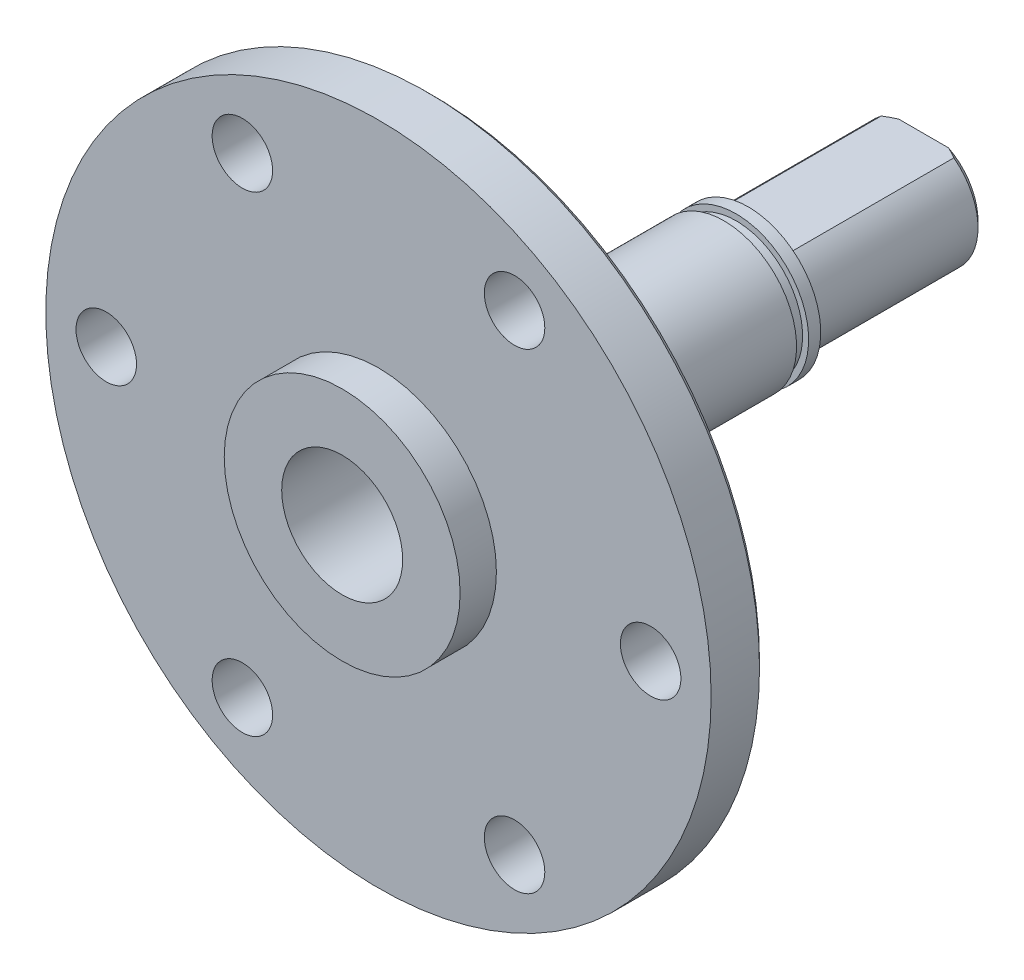
ISO-10303-21;
HEADER;
FILE_DESCRIPTION(('STEP AP214'),'2;1');
FILE_NAME('part.step','',(''),(''),'','','');
FILE_SCHEMA(('AUTOMOTIVE_DESIGN { 1 0 10303 214 1 1 1 1 }'));
ENDSEC;
DATA;
#1=APPLICATION_CONTEXT('core data for automotive mechanical design processes');
#2=APPLICATION_PROTOCOL_DEFINITION('international standard','automotive_design',2000,#1);
#3=PRODUCT_CONTEXT('',#1,'mechanical');
#4=PRODUCT('Part','Part','',(#3));
#5=PRODUCT_RELATED_PRODUCT_CATEGORY('part','',(#4));
#6=PRODUCT_DEFINITION_FORMATION('','',#4);
#7=PRODUCT_DEFINITION_CONTEXT('part definition',#1,'design');
#8=PRODUCT_DEFINITION('design','',#6,#7);
#9=PRODUCT_DEFINITION_SHAPE('','',#8);
#10=(LENGTH_UNIT() NAMED_UNIT(*) SI_UNIT(.MILLI.,.METRE.));
#11=(NAMED_UNIT(*) PLANE_ANGLE_UNIT() SI_UNIT($,.RADIAN.));
#12=(NAMED_UNIT(*) SI_UNIT($,.STERADIAN.) SOLID_ANGLE_UNIT());
#13=UNCERTAINTY_MEASURE_WITH_UNIT(LENGTH_MEASURE(1.E-05),#10,'distance_accuracy_value','');
#14=(GEOMETRIC_REPRESENTATION_CONTEXT(3) GLOBAL_UNCERTAINTY_ASSIGNED_CONTEXT((#13)) GLOBAL_UNIT_ASSIGNED_CONTEXT((#10,
#11,#12)) REPRESENTATION_CONTEXT('',''));
#15=CARTESIAN_POINT('',(0.,0.,0.));
#16=DIRECTION('',(0.,0.,1.));
#17=DIRECTION('',(1.,0.,0.));
#18=AXIS2_PLACEMENT_3D('',#15,#16,#17);
#19=CARTESIAN_POINT('',(0.,0.,3.));
#20=DIRECTION('',(0.,0.,1.));
#21=DIRECTION('',(1.,0.,0.));
#22=AXIS2_PLACEMENT_3D('',#19,#20,#21);
#23=PLANE('',#22);
#24=CARTESIAN_POINT('',(-22.5,0.,3.));
#25=DIRECTION('',(0.,0.,1.));
#26=DIRECTION('',(1.,0.,0.));
#27=AXIS2_PLACEMENT_3D('',#24,#25,#26);
#28=CIRCLE('',#27,2.49999999999998);
#29=CARTESIAN_POINT('',(-20.,0.,3.));
#30=VERTEX_POINT('',#29);
#31=EDGE_CURVE('E104',#30,#30,#28,.T.);
#32=ORIENTED_EDGE('',*,*,#31,.F.);
#33=EDGE_LOOP('',(#32));
#34=FACE_BOUND('',#33,.T.);
#35=CARTESIAN_POINT('',(-11.25,19.48557158515,3.));
#36=DIRECTION('',(0.,0.,1.));
#37=DIRECTION('',(1.,0.,0.));
#38=AXIS2_PLACEMENT_3D('',#35,#36,#37);
#39=CIRCLE('',#38,2.49999999999998);
#40=CARTESIAN_POINT('',(-8.75000000000001,19.48557158515,3.));
#41=VERTEX_POINT('',#40);
#42=EDGE_CURVE('E110',#41,#41,#39,.T.);
#43=ORIENTED_EDGE('',*,*,#42,.F.);
#44=EDGE_LOOP('',(#43));
#45=FACE_BOUND('',#44,.T.);
#46=CARTESIAN_POINT('',(11.25,19.48557158515,3.));
#47=DIRECTION('',(0.,0.,1.));
#48=DIRECTION('',(1.,0.,0.));
#49=AXIS2_PLACEMENT_3D('',#46,#47,#48);
#50=CIRCLE('',#49,2.49999999999998);
#51=CARTESIAN_POINT('',(13.75,19.48557158515,3.));
#52=VERTEX_POINT('',#51);
#53=EDGE_CURVE('E116',#52,#52,#50,.T.);
#54=ORIENTED_EDGE('',*,*,#53,.F.);
#55=EDGE_LOOP('',(#54));
#56=FACE_BOUND('',#55,.T.);
#57=CARTESIAN_POINT('',(22.5,0.,3.));
#58=DIRECTION('',(0.,0.,1.));
#59=DIRECTION('',(1.,0.,0.));
#60=AXIS2_PLACEMENT_3D('',#57,#58,#59);
#61=CIRCLE('',#60,2.49999999999998);
#62=CARTESIAN_POINT('',(25.,0.,3.));
#63=VERTEX_POINT('',#62);
#64=EDGE_CURVE('E122',#63,#63,#61,.T.);
#65=ORIENTED_EDGE('',*,*,#64,.F.);
#66=EDGE_LOOP('',(#65));
#67=FACE_BOUND('',#66,.T.);
#68=CARTESIAN_POINT('',(11.25,-19.48557158515,3.));
#69=DIRECTION('',(0.,0.,1.));
#70=DIRECTION('',(1.,0.,0.));
#71=AXIS2_PLACEMENT_3D('',#68,#69,#70);
#72=CIRCLE('',#71,2.49999999999998);
#73=CARTESIAN_POINT('',(13.75,-19.48557158515,3.));
#74=VERTEX_POINT('',#73);
#75=EDGE_CURVE('E128',#74,#74,#72,.T.);
#76=ORIENTED_EDGE('',*,*,#75,.F.);
#77=EDGE_LOOP('',(#76));
#78=FACE_BOUND('',#77,.T.);
#79=CARTESIAN_POINT('',(-11.25,-19.48557158515,3.));
#80=DIRECTION('',(0.,0.,1.));
#81=DIRECTION('',(1.,0.,0.));
#82=AXIS2_PLACEMENT_3D('',#79,#80,#81);
#83=CIRCLE('',#82,2.49999999999998);
#84=CARTESIAN_POINT('',(-8.75000000000001,-19.48557158515,3.));
#85=VERTEX_POINT('',#84);
#86=EDGE_CURVE('E134',#85,#85,#83,.T.);
#87=ORIENTED_EDGE('',*,*,#86,.F.);
#88=EDGE_LOOP('',(#87));
#89=FACE_BOUND('',#88,.T.);
#90=CARTESIAN_POINT('',(0.,0.,3.));
#91=DIRECTION('',(0.,0.,1.));
#92=DIRECTION('',(1.,0.,0.));
#93=AXIS2_PLACEMENT_3D('',#90,#91,#92);
#94=CIRCLE('',#93,27.5);
#95=CARTESIAN_POINT('',(27.5,0.,3.));
#96=VERTEX_POINT('',#95);
#97=EDGE_CURVE('E144',#96,#96,#94,.T.);
#98=ORIENTED_EDGE('',*,*,#97,.T.);
#99=EDGE_LOOP('',(#98));
#100=FACE_BOUND('',#99,.T.);
#101=CARTESIAN_POINT('',(0.,0.,3.));
#102=DIRECTION('',(0.,0.,1.));
#103=DIRECTION('',(1.,0.,0.));
#104=AXIS2_PLACEMENT_3D('',#101,#102,#103);
#105=CIRCLE('',#104,9.75);
#106=CARTESIAN_POINT('',(9.75,0.,3.));
#107=VERTEX_POINT('',#106);
#108=EDGE_CURVE('E137',#107,#107,#105,.T.);
#109=ORIENTED_EDGE('',*,*,#108,.F.);
#110=EDGE_LOOP('',(#109));
#111=FACE_BOUND('',#110,.T.);
#112=ADVANCED_FACE('F45',(#34,#45,#56,#67,#78,#89,#100,#111),#23,.T.);
#113=CARTESIAN_POINT('',(0.,0.,-27.56));
#114=DIRECTION('',(0.,0.,-1.));
#115=DIRECTION('',(-1.,0.,0.));
#116=AXIS2_PLACEMENT_3D('',#113,#114,#115);
#117=PLANE('',#116);
#118=CARTESIAN_POINT('',(0.,0.,-27.56));
#119=DIRECTION('',(0.,0.,-1.));
#120=DIRECTION('',(-1.,0.,0.));
#121=AXIS2_PLACEMENT_3D('',#118,#119,#120);
#122=CIRCLE('',#121,6.);
#123=CARTESIAN_POINT('',(-6.,0.,-27.56));
#124=VERTEX_POINT('',#123);
#125=EDGE_CURVE('E143',#124,#124,#122,.F.);
#126=ORIENTED_EDGE('',*,*,#125,.F.);
#127=EDGE_LOOP('',(#126));
#128=FACE_BOUND('',#127,.T.);
#129=CARTESIAN_POINT('',(0.,0.,-27.56));
#130=DIRECTION('',(0.,0.,-1.));
#131=DIRECTION('',(-1.,0.,0.));
#132=AXIS2_PLACEMENT_3D('',#129,#130,#131);
#133=CIRCLE('',#132,5.);
#134=CARTESIAN_POINT('',(-5.,0.,-27.56));
#135=VERTEX_POINT('',#134);
#136=EDGE_CURVE('E140',#135,#135,#133,.T.);
#137=ORIENTED_EDGE('',*,*,#136,.F.);
#138=EDGE_LOOP('',(#137));
#139=FACE_BOUND('',#138,.T.);
#140=ADVANCED_FACE('F317',(#128,#139),#117,.T.);
#141=CARTESIAN_POINT('',(0.,0.,-26.56));
#142=DIRECTION('',(0.,0.,-1.));
#143=DIRECTION('',(-1.,0.,0.));
#144=AXIS2_PLACEMENT_3D('',#141,#142,#143);
#145=CYLINDRICAL_SURFACE('',#144,6.);
#146=ORIENTED_EDGE('',*,*,#125,.T.);
#147=EDGE_LOOP('',(#146));
#148=FACE_BOUND('',#147,.T.);
#149=CARTESIAN_POINT('',(0.,0.,-26.56));
#150=DIRECTION('',(0.,0.,-1.));
#151=DIRECTION('',(-1.,0.,0.));
#152=AXIS2_PLACEMENT_3D('',#149,#150,#151);
#153=CIRCLE('',#152,6.);
#154=CARTESIAN_POINT('',(-6.,0.,-26.56));
#155=VERTEX_POINT('',#154);
#156=EDGE_CURVE('E170',#155,#155,#153,.T.);
#157=ORIENTED_EDGE('',*,*,#156,.T.);
#158=EDGE_LOOP('',(#157));
#159=FACE_BOUND('',#158,.T.);
#160=ADVANCED_FACE('F314',(#148,#159),#145,.T.);
#161=CARTESIAN_POINT('',(0.,0.,-26.56));
#162=DIRECTION('',(0.,0.,-1.));
#163=DIRECTION('',(-1.,0.,0.));
#164=AXIS2_PLACEMENT_3D('',#161,#162,#163);
#165=PLANE('',#164);
#166=CARTESIAN_POINT('',(0.,0.,-26.56));
#167=DIRECTION('',(0.,0.,-1.));
#168=DIRECTION('',(-1.,0.,0.));
#169=AXIS2_PLACEMENT_3D('',#166,#167,#168);
#170=CIRCLE('',#169,5.5);
#171=CARTESIAN_POINT('',(-5.5,0.,-26.56));
#172=VERTEX_POINT('',#171);
#173=EDGE_CURVE('E176',#172,#172,#170,.F.);
#174=ORIENTED_EDGE('',*,*,#173,.F.);
#175=EDGE_LOOP('',(#174));
#176=FACE_BOUND('',#175,.T.);
#177=ORIENTED_EDGE('',*,*,#156,.F.);
#178=EDGE_LOOP('',(#177));
#179=FACE_BOUND('',#178,.T.);
#180=ADVANCED_FACE('F345',(#176,#179),#165,.F.);
#181=CARTESIAN_POINT('',(0.,0.,-25.56));
#182=DIRECTION('',(0.,0.,-1.));
#183=DIRECTION('',(-1.,0.,0.));
#184=AXIS2_PLACEMENT_3D('',#181,#182,#183);
#185=CYLINDRICAL_SURFACE('',#184,5.5);
#186=CARTESIAN_POINT('',(0.,0.,-25.56));
#187=DIRECTION('',(0.,0.,-1.));
#188=DIRECTION('',(-1.,0.,0.));
#189=AXIS2_PLACEMENT_3D('',#186,#187,#188);
#190=CIRCLE('',#189,5.5);
#191=CARTESIAN_POINT('',(-5.5,0.,-25.56));
#192=VERTEX_POINT('',#191);
#193=EDGE_CURVE('E379',#192,#192,#190,.F.);
#194=ORIENTED_EDGE('',*,*,#193,.F.);
#195=EDGE_LOOP('',(#194));
#196=FACE_BOUND('',#195,.T.);
#197=ORIENTED_EDGE('',*,*,#173,.T.);
#198=EDGE_LOOP('',(#197));
#199=FACE_BOUND('',#198,.T.);
#200=ADVANCED_FACE('F341',(#196,#199),#185,.T.);
#201=CARTESIAN_POINT('',(0.,0.,-25.56));
#202=DIRECTION('',(0.,0.,-1.));
#203=DIRECTION('',(-1.,0.,0.));
#204=AXIS2_PLACEMENT_3D('',#201,#202,#203);
#205=PLANE('',#204);
#206=ORIENTED_EDGE('',*,*,#193,.T.);
#207=EDGE_LOOP('',(#206));
#208=FACE_BOUND('',#207,.T.);
#209=CARTESIAN_POINT('',(0.,0.,-25.56));
#210=DIRECTION('',(0.,0.,-1.));
#211=DIRECTION('',(-1.,0.,0.));
#212=AXIS2_PLACEMENT_3D('',#209,#210,#211);
#213=CIRCLE('',#212,6.);
#214=CARTESIAN_POINT('',(-6.,0.,-25.56));
#215=VERTEX_POINT('',#214);
#216=EDGE_CURVE('E373',#215,#215,#213,.F.);
#217=ORIENTED_EDGE('',*,*,#216,.F.);
#218=EDGE_LOOP('',(#217));
#219=FACE_BOUND('',#218,.T.);
#220=ADVANCED_FACE('F337',(#208,#219),#205,.T.);
#221=CARTESIAN_POINT('',(0.,0.,-14.56));
#222=DIRECTION('',(0.,0.,-1.));
#223=DIRECTION('',(-1.,0.,0.));
#224=AXIS2_PLACEMENT_3D('',#221,#222,#223);
#225=CYLINDRICAL_SURFACE('',#224,6.);
#226=ORIENTED_EDGE('',*,*,#216,.T.);
#227=EDGE_LOOP('',(#226));
#228=FACE_BOUND('',#227,.T.);
#229=CARTESIAN_POINT('',(0.,0.,-14.56));
#230=DIRECTION('',(0.,0.,-1.));
#231=DIRECTION('',(-1.,0.,0.));
#232=AXIS2_PLACEMENT_3D('',#229,#230,#231);
#233=CIRCLE('',#232,6.);
#234=CARTESIAN_POINT('',(-6.,0.,-14.56));
#235=VERTEX_POINT('',#234);
#236=EDGE_CURVE('E369',#235,#235,#233,.F.);
#237=ORIENTED_EDGE('',*,*,#236,.F.);
#238=EDGE_LOOP('',(#237));
#239=FACE_BOUND('',#238,.T.);
#240=ADVANCED_FACE('F333',(#228,#239),#225,.T.);
#241=CARTESIAN_POINT('',(0.,0.,-14.56));
#242=DIRECTION('',(0.,0.,-1.));
#243=DIRECTION('',(-1.,0.,0.));
#244=AXIS2_PLACEMENT_3D('',#241,#242,#243);
#245=PLANE('',#244);
#246=CARTESIAN_POINT('',(0.,0.,-14.56));
#247=DIRECTION('',(0.,0.,-1.));
#248=DIRECTION('',(-1.,0.,0.));
#249=AXIS2_PLACEMENT_3D('',#246,#247,#248);
#250=CIRCLE('',#249,8.49992750991389);
#251=CARTESIAN_POINT('',(-8.49992750991389,0.,-14.56));
#252=VERTEX_POINT('',#251);
#253=EDGE_CURVE('E243',#252,#252,#250,.T.);
#254=ORIENTED_EDGE('',*,*,#253,.T.);
#255=EDGE_LOOP('',(#254));
#256=FACE_BOUND('',#255,.T.);
#257=ORIENTED_EDGE('',*,*,#236,.T.);
#258=EDGE_LOOP('',(#257));
#259=FACE_BOUND('',#258,.T.);
#260=ADVANCED_FACE('F329',(#256,#259),#245,.T.);
#261=CARTESIAN_POINT('',(0.,0.,0.));
#262=DIRECTION('',(0.,0.,-1.));
#263=DIRECTION('',(-1.,0.,0.));
#264=AXIS2_PLACEMENT_3D('',#261,#262,#263);
#265=CYLINDRICAL_SURFACE('',#264,9.);
#266=CARTESIAN_POINT('',(0.,0.,-14.0599232451364));
#267=DIRECTION('',(0.,0.,-1.));
#268=DIRECTION('',(-1.,0.,0.));
#269=AXIS2_PLACEMENT_3D('',#266,#267,#268);
#270=CIRCLE('',#269,9.);
#271=CARTESIAN_POINT('',(-9.,0.,-14.0599232451364));
#272=VERTEX_POINT('',#271);
#273=EDGE_CURVE('E149',#272,#272,#270,.F.);
#274=ORIENTED_EDGE('',*,*,#273,.T.);
#275=EDGE_LOOP('',(#274));
#276=FACE_BOUND('',#275,.T.);
#277=CARTESIAN_POINT('',(0.,0.,-1.5));
#278=DIRECTION('',(0.,0.,-1.));
#279=DIRECTION('',(-1.,0.,0.));
#280=AXIS2_PLACEMENT_3D('',#277,#278,#279);
#281=CIRCLE('',#280,9.);
#282=CARTESIAN_POINT('',(-9.,0.,-1.5));
#283=VERTEX_POINT('',#282);
#284=EDGE_CURVE('E150',#283,#283,#281,.T.);
#285=ORIENTED_EDGE('',*,*,#284,.T.);
#286=EDGE_LOOP('',(#285));
#287=FACE_BOUND('',#286,.T.);
#288=ADVANCED_FACE('F325',(#276,#287),#265,.T.);
#289=CARTESIAN_POINT('',(0.,0.,-1.5));
#290=DIRECTION('',(0.,0.,1.));
#291=DIRECTION('',(1.,0.,0.));
#292=AXIS2_PLACEMENT_3D('',#289,#290,#291);
#293=PLANE('',#292);
#294=CARTESIAN_POINT('',(0.,0.,-1.5));
#295=DIRECTION('',(0.,0.,1.));
#296=DIRECTION('',(1.,0.,0.));
#297=AXIS2_PLACEMENT_3D('',#294,#295,#296);
#298=CIRCLE('',#297,27.0000012770885);
#299=CARTESIAN_POINT('',(27.0000012770885,0.,-1.5));
#300=VERTEX_POINT('',#299);
#301=EDGE_CURVE('E253',#300,#300,#298,.F.);
#302=ORIENTED_EDGE('',*,*,#301,.T.);
#303=EDGE_LOOP('',(#302));
#304=FACE_BOUND('',#303,.T.);
#305=CARTESIAN_POINT('',(-22.5,0.,-1.5));
#306=DIRECTION('',(0.,0.,-1.));
#307=DIRECTION('',(-1.,0.,0.));
#308=AXIS2_PLACEMENT_3D('',#305,#306,#307);
#309=CIRCLE('',#308,2.49999999999999);
#310=CARTESIAN_POINT('',(-25.,0.,-1.5));
#311=VERTEX_POINT('',#310);
#312=EDGE_CURVE('E98',#311,#311,#309,.T.);
#313=ORIENTED_EDGE('',*,*,#312,.F.);
#314=EDGE_LOOP('',(#313));
#315=FACE_BOUND('',#314,.T.);
#316=CARTESIAN_POINT('',(-11.25,19.48557158515,-1.5));
#317=DIRECTION('',(0.,0.,-1.));
#318=DIRECTION('',(-1.,0.,0.));
#319=AXIS2_PLACEMENT_3D('',#316,#317,#318);
#320=CIRCLE('',#319,2.49999999999999);
#321=CARTESIAN_POINT('',(-13.75,19.48557158515,-1.5));
#322=VERTEX_POINT('',#321);
#323=EDGE_CURVE('E107',#322,#322,#320,.T.);
#324=ORIENTED_EDGE('',*,*,#323,.F.);
#325=EDGE_LOOP('',(#324));
#326=FACE_BOUND('',#325,.T.);
#327=CARTESIAN_POINT('',(11.25,19.48557158515,-1.5));
#328=DIRECTION('',(0.,0.,-1.));
#329=DIRECTION('',(-1.,0.,0.));
#330=AXIS2_PLACEMENT_3D('',#327,#328,#329);
#331=CIRCLE('',#330,2.49999999999999);
#332=CARTESIAN_POINT('',(8.75000000000001,19.48557158515,-1.5));
#333=VERTEX_POINT('',#332);
#334=EDGE_CURVE('E113',#333,#333,#331,.T.);
#335=ORIENTED_EDGE('',*,*,#334,.F.);
#336=EDGE_LOOP('',(#335));
#337=FACE_BOUND('',#336,.T.);
#338=CARTESIAN_POINT('',(22.5,0.,-1.5));
#339=DIRECTION('',(0.,0.,-1.));
#340=DIRECTION('',(-1.,0.,0.));
#341=AXIS2_PLACEMENT_3D('',#338,#339,#340);
#342=CIRCLE('',#341,2.49999999999999);
#343=CARTESIAN_POINT('',(20.,0.,-1.5));
#344=VERTEX_POINT('',#343);
#345=EDGE_CURVE('E119',#344,#344,#342,.T.);
#346=ORIENTED_EDGE('',*,*,#345,.F.);
#347=EDGE_LOOP('',(#346));
#348=FACE_BOUND('',#347,.T.);
#349=CARTESIAN_POINT('',(11.25,-19.48557158515,-1.5));
#350=DIRECTION('',(0.,0.,-1.));
#351=DIRECTION('',(-1.,0.,0.));
#352=AXIS2_PLACEMENT_3D('',#349,#350,#351);
#353=CIRCLE('',#352,2.49999999999999);
#354=CARTESIAN_POINT('',(8.75000000000001,-19.48557158515,-1.5));
#355=VERTEX_POINT('',#354);
#356=EDGE_CURVE('E125',#355,#355,#353,.T.);
#357=ORIENTED_EDGE('',*,*,#356,.F.);
#358=EDGE_LOOP('',(#357));
#359=FACE_BOUND('',#358,.T.);
#360=CARTESIAN_POINT('',(-11.25,-19.48557158515,-1.5));
#361=DIRECTION('',(0.,0.,-1.));
#362=DIRECTION('',(-1.,0.,0.));
#363=AXIS2_PLACEMENT_3D('',#360,#361,#362);
#364=CIRCLE('',#363,2.49999999999999);
#365=CARTESIAN_POINT('',(-13.75,-19.48557158515,-1.5));
#366=VERTEX_POINT('',#365);
#367=EDGE_CURVE('E131',#366,#366,#364,.T.);
#368=ORIENTED_EDGE('',*,*,#367,.F.);
#369=EDGE_LOOP('',(#368));
#370=FACE_BOUND('',#369,.T.);
#371=ORIENTED_EDGE('',*,*,#284,.F.);
#372=EDGE_LOOP('',(#371));
#373=FACE_BOUND('',#372,.T.);
#374=ADVANCED_FACE('F321',(#304,#315,#326,#337,#348,#359,#370,#373),#293,.F.);
#375=CARTESIAN_POINT('',(0.,0.,0.));
#376=DIRECTION('',(0.,0.,1.));
#377=DIRECTION('',(1.,0.,0.));
#378=AXIS2_PLACEMENT_3D('',#375,#376,#377);
#379=CYLINDRICAL_SURFACE('',#378,27.5);
#380=CARTESIAN_POINT('',(0.,0.,-1.00000133265843));
#381=DIRECTION('',(0.,0.,1.));
#382=DIRECTION('',(1.,0.,0.));
#383=AXIS2_PLACEMENT_3D('',#380,#381,#382);
#384=CIRCLE('',#383,27.5);
#385=CARTESIAN_POINT('',(27.5,0.,-1.00000133265843));
#386=VERTEX_POINT('',#385);
#387=EDGE_CURVE('E250',#386,#386,#384,.T.);
#388=ORIENTED_EDGE('',*,*,#387,.T.);
#389=EDGE_LOOP('',(#388));
#390=FACE_BOUND('',#389,.T.);
#391=ORIENTED_EDGE('',*,*,#97,.F.);
#392=EDGE_LOOP('',(#391));
#393=FACE_BOUND('',#392,.T.);
#394=ADVANCED_FACE('F313',(#390,#393),#379,.T.);
#395=CARTESIAN_POINT('',(0.,0.,-42.06));
#396=DIRECTION('',(0.,0.,1.));
#397=DIRECTION('',(1.,0.,0.));
#398=AXIS2_PLACEMENT_3D('',#395,#396,#397);
#399=CYLINDRICAL_SURFACE('',#398,5.);
#400=CARTESIAN_POINT('',(0.,0.,-41.5599004636021));
#401=DIRECTION('',(0.,0.,-1.));
#402=DIRECTION('',(-1.,0.,0.));
#403=AXIS2_PLACEMENT_3D('',#400,#401,#402);
#404=CIRCLE('',#403,5.);
#405=CARTESIAN_POINT('',(-3.,4.,-41.5599004636021));
#406=VERTEX_POINT('',#405);
#407=CARTESIAN_POINT('',(3.,4.,-41.5599004636021));
#408=VERTEX_POINT('',#407);
#409=EDGE_CURVE('E94',#406,#408,#404,.F.);
#410=ORIENTED_EDGE('',*,*,#409,.T.);
#411=DIRECTION('',(0.,0.,1.));
#412=VECTOR('',#411,1.);
#413=CARTESIAN_POINT('',(3.,4.,-42.06));
#414=LINE('',#413,#412);
#415=CARTESIAN_POINT('',(3.,4.,-28.06));
#416=VERTEX_POINT('',#415);
#417=EDGE_CURVE('E67',#408,#416,#414,.T.);
#418=ORIENTED_EDGE('',*,*,#417,.T.);
#419=CARTESIAN_POINT('',(0.,0.,-28.06));
#420=DIRECTION('',(0.,0.,1.));
#421=DIRECTION('',(1.,0.,0.));
#422=AXIS2_PLACEMENT_3D('',#419,#420,#421);
#423=CIRCLE('',#422,5.);
#424=CARTESIAN_POINT('',(-3.,4.,-28.06));
#425=VERTEX_POINT('',#424);
#426=EDGE_CURVE('E13',#416,#425,#423,.T.);
#427=ORIENTED_EDGE('',*,*,#426,.T.);
#428=DIRECTION('',(0.,0.,1.));
#429=VECTOR('',#428,1.);
#430=CARTESIAN_POINT('',(-3.,4.,-42.06));
#431=LINE('',#430,#429);
#432=EDGE_CURVE('E79',#425,#406,#431,.F.);
#433=ORIENTED_EDGE('',*,*,#432,.T.);
#434=EDGE_LOOP('',(#410,#418,#427,#433));
#435=FACE_BOUND('',#434,.T.);
#436=ORIENTED_EDGE('',*,*,#136,.T.);
#437=EDGE_LOOP('',(#436));
#438=FACE_BOUND('',#437,.T.);
#439=ADVANCED_FACE('F92',(#435,#438),#399,.T.);
#440=CARTESIAN_POINT('',(0.,0.,-42.06));
#441=DIRECTION('',(0.,0.,-1.));
#442=DIRECTION('',(-1.,0.,0.));
#443=AXIS2_PLACEMENT_3D('',#440,#441,#442);
#444=PLANE('',#443);
#445=DIRECTION('',(-1.,0.,0.));
#446=VECTOR('',#445,1.);
#447=CARTESIAN_POINT('',(0.,4.,-42.06));
#448=LINE('',#447,#446);
#449=CARTESIAN_POINT('',(2.06135968107569,4.,-42.06));
#450=VERTEX_POINT('',#449);
#451=CARTESIAN_POINT('',(-2.06135968107569,4.,-42.06));
#452=VERTEX_POINT('',#451);
#453=EDGE_CURVE('E61',#450,#452,#448,.T.);
#454=ORIENTED_EDGE('',*,*,#453,.F.);
#455=CARTESIAN_POINT('',(0.,0.,-42.06));
#456=DIRECTION('',(0.,0.,-1.));
#457=DIRECTION('',(-1.,0.,0.));
#458=AXIS2_PLACEMENT_3D('',#455,#456,#457);
#459=CIRCLE('',#458,4.49991152521519);
#460=EDGE_CURVE('E246',#450,#452,#459,.T.);
#461=ORIENTED_EDGE('',*,*,#460,.T.);
#462=EDGE_LOOP('',(#454,#461));
#463=FACE_BOUND('',#462,.T.);
#464=ADVANCED_FACE('F306',(#463),#444,.T.);
#465=CARTESIAN_POINT('',(0.,0.,33.8));
#466=DIRECTION('',(0.,0.,-1.));
#467=DIRECTION('',(-1.,0.,0.));
#468=AXIS2_PLACEMENT_3D('',#465,#466,#467);
#469=CYLINDRICAL_SURFACE('',#468,9.75);
#470=CARTESIAN_POINT('',(0.,0.,6.));
#471=DIRECTION('',(0.,0.,-1.));
#472=DIRECTION('',(-1.,0.,0.));
#473=AXIS2_PLACEMENT_3D('',#470,#471,#472);
#474=CIRCLE('',#473,9.75);
#475=CARTESIAN_POINT('',(-9.75,0.,6.));
#476=VERTEX_POINT('',#475);
#477=EDGE_CURVE('E90',#476,#476,#474,.T.);
#478=ORIENTED_EDGE('',*,*,#477,.T.);
#479=EDGE_LOOP('',(#478));
#480=FACE_BOUND('',#479,.T.);
#481=ORIENTED_EDGE('',*,*,#108,.T.);
#482=EDGE_LOOP('',(#481));
#483=FACE_BOUND('',#482,.T.);
#484=ADVANCED_FACE('F302',(#480,#483),#469,.T.);
#485=CARTESIAN_POINT('',(-11.25,-19.48557158515,-1.5));
#486=DIRECTION('',(0.,0.,-1.));
#487=DIRECTION('',(-1.,0.,0.));
#488=AXIS2_PLACEMENT_3D('',#485,#486,#487);
#489=CYLINDRICAL_SURFACE('',#488,2.49999999999998);
#490=ORIENTED_EDGE('',*,*,#86,.T.);
#491=EDGE_LOOP('',(#490));
#492=FACE_BOUND('',#491,.T.);
#493=ORIENTED_EDGE('',*,*,#367,.T.);
#494=EDGE_LOOP('',(#493));
#495=FACE_BOUND('',#494,.T.);
#496=ADVANCED_FACE('F298',(#492,#495),#489,.F.);
#497=CARTESIAN_POINT('',(11.25,-19.48557158515,-1.5));
#498=DIRECTION('',(0.,0.,-1.));
#499=DIRECTION('',(-1.,0.,0.));
#500=AXIS2_PLACEMENT_3D('',#497,#498,#499);
#501=CYLINDRICAL_SURFACE('',#500,2.49999999999998);
#502=ORIENTED_EDGE('',*,*,#75,.T.);
#503=EDGE_LOOP('',(#502));
#504=FACE_BOUND('',#503,.T.);
#505=ORIENTED_EDGE('',*,*,#356,.T.);
#506=EDGE_LOOP('',(#505));
#507=FACE_BOUND('',#506,.T.);
#508=ADVANCED_FACE('F294',(#504,#507),#501,.F.);
#509=CARTESIAN_POINT('',(22.5,0.,-1.5));
#510=DIRECTION('',(0.,0.,-1.));
#511=DIRECTION('',(-1.,0.,0.));
#512=AXIS2_PLACEMENT_3D('',#509,#510,#511);
#513=CYLINDRICAL_SURFACE('',#512,2.49999999999998);
#514=ORIENTED_EDGE('',*,*,#64,.T.);
#515=EDGE_LOOP('',(#514));
#516=FACE_BOUND('',#515,.T.);
#517=ORIENTED_EDGE('',*,*,#345,.T.);
#518=EDGE_LOOP('',(#517));
#519=FACE_BOUND('',#518,.T.);
#520=ADVANCED_FACE('F290',(#516,#519),#513,.F.);
#521=CARTESIAN_POINT('',(11.25,19.48557158515,-1.5));
#522=DIRECTION('',(0.,0.,-1.));
#523=DIRECTION('',(-1.,0.,0.));
#524=AXIS2_PLACEMENT_3D('',#521,#522,#523);
#525=CYLINDRICAL_SURFACE('',#524,2.49999999999998);
#526=ORIENTED_EDGE('',*,*,#53,.T.);
#527=EDGE_LOOP('',(#526));
#528=FACE_BOUND('',#527,.T.);
#529=ORIENTED_EDGE('',*,*,#334,.T.);
#530=EDGE_LOOP('',(#529));
#531=FACE_BOUND('',#530,.T.);
#532=ADVANCED_FACE('F286',(#528,#531),#525,.F.);
#533=CARTESIAN_POINT('',(-11.25,19.48557158515,-1.5));
#534=DIRECTION('',(0.,0.,-1.));
#535=DIRECTION('',(-1.,0.,0.));
#536=AXIS2_PLACEMENT_3D('',#533,#534,#535);
#537=CYLINDRICAL_SURFACE('',#536,2.49999999999998);
#538=ORIENTED_EDGE('',*,*,#42,.T.);
#539=EDGE_LOOP('',(#538));
#540=FACE_BOUND('',#539,.T.);
#541=ORIENTED_EDGE('',*,*,#323,.T.);
#542=EDGE_LOOP('',(#541));
#543=FACE_BOUND('',#542,.T.);
#544=ADVANCED_FACE('F282',(#540,#543),#537,.F.);
#545=CARTESIAN_POINT('',(-22.5,0.,-1.5));
#546=DIRECTION('',(0.,0.,-1.));
#547=DIRECTION('',(-1.,0.,0.));
#548=AXIS2_PLACEMENT_3D('',#545,#546,#547);
#549=CYLINDRICAL_SURFACE('',#548,2.49999999999998);
#550=ORIENTED_EDGE('',*,*,#31,.T.);
#551=EDGE_LOOP('',(#550));
#552=FACE_BOUND('',#551,.T.);
#553=ORIENTED_EDGE('',*,*,#312,.T.);
#554=EDGE_LOOP('',(#553));
#555=FACE_BOUND('',#554,.T.);
#556=ADVANCED_FACE('F278',(#552,#555),#549,.F.);
#557=CARTESIAN_POINT('',(0.,0.,-14.0599232451364));
#558=DIRECTION('',(0.,0.,1.));
#559=DIRECTION('',(1.,0.,0.));
#560=AXIS2_PLACEMENT_3D('',#557,#558,#559);
#561=CONICAL_SURFACE('',#560,9.,0.785393899256352);
#562=ORIENTED_EDGE('',*,*,#253,.F.);
#563=EDGE_LOOP('',(#562));
#564=FACE_BOUND('',#563,.T.);
#565=ORIENTED_EDGE('',*,*,#273,.F.);
#566=EDGE_LOOP('',(#565));
#567=FACE_BOUND('',#566,.T.);
#568=ADVANCED_FACE('F281',(#564,#567),#561,.T.);
#569=CARTESIAN_POINT('',(0.,0.,-42.06));
#570=DIRECTION('',(0.,0.,1.));
#571=DIRECTION('',(1.,0.,0.));
#572=AXIS2_PLACEMENT_3D('',#569,#570,#571);
#573=CONICAL_SURFACE('',#572,4.49991152521519,0.785387103863712);
#574=CARTESIAN_POINT('',(10.255071741685,4.,-35.5522021625895));
#575=CARTESIAN_POINT('',(10.098444945087,4.,-35.6981224211307));
#576=CARTESIAN_POINT('',(9.94160082616481,4.,-35.8438093147462));
#577=CARTESIAN_POINT('',(9.62741060299306,4.,-36.1346428350627));
#578=CARTESIAN_POINT('',(9.47006449537848,4.,-36.2797894581278));
#579=CARTESIAN_POINT('',(8.99710553775548,4.,-36.7143698132808));
#580=CARTESIAN_POINT('',(8.68064135013931,4.,-37.0028793503037));
#581=CARTESIAN_POINT('',(8.042592647821,4.,-37.578486998484));
#582=CARTESIAN_POINT('',(7.72098806625362,4.,-37.8655628983162));
#583=CARTESIAN_POINT('',(7.07367576658546,4.,-38.4349885900569));
#584=CARTESIAN_POINT('',(6.7479685792659,4.,-38.7173389825488));
#585=CARTESIAN_POINT('',(6.15647244747317,4.,-39.2193517616595));
#586=CARTESIAN_POINT('',(5.89173614597334,4.,-39.440252016876));
#587=CARTESIAN_POINT('',(5.35712696906623,4.,-39.875953585122));
#588=CARTESIAN_POINT('',(5.08725268915677,4.,-40.0907531893211));
#589=CARTESIAN_POINT('',(4.6773919488753,4.,-40.405976386201));
#590=CARTESIAN_POINT('',(4.5400329331999,4.,-40.5098143365821));
#591=CARTESIAN_POINT('',(4.26323343776356,4.,-40.7146725488807));
#592=CARTESIAN_POINT('',(4.12379306285857,4.,-40.8156929520117));
#593=CARTESIAN_POINT('',(3.842493103219,4.,-41.0141850562858));
#594=CARTESIAN_POINT('',(3.70063461609756,4.,-41.11165830769));
#595=CARTESIAN_POINT('',(3.41397564007916,4.,-41.3021623535859));
#596=CARTESIAN_POINT('',(3.26917553546262,4.,-41.3951937230936));
#597=CARTESIAN_POINT('',(2.98960344334554,4.,-41.5672320413402));
#598=CARTESIAN_POINT('',(2.85514153735789,4.,-41.6467404891971));
#599=CARTESIAN_POINT('',(2.58283735358662,4.,-41.7998254782637));
#600=CARTESIAN_POINT('',(2.44499471087171,4.,-41.8734013753802));
#601=CARTESIAN_POINT('',(2.16554547580757,4.,-42.0129404110271));
#602=CARTESIAN_POINT('',(2.02394043993456,4.,-42.0789066391045));
#603=CARTESIAN_POINT('',(1.73658403687651,4.,-42.2011493476814));
#604=CARTESIAN_POINT('',(1.59083373770799,4.,-42.2574282981972));
#605=CARTESIAN_POINT('',(1.32606296097307,4.,-42.3472756600832));
#606=CARTESIAN_POINT('',(1.20782368180529,4.,-42.3831322243697));
#607=CARTESIAN_POINT('',(0.968992337416081,4.,-42.4458363499554));
#608=CARTESIAN_POINT('',(0.848401156303584,4.,-42.4726872300736));
#609=CARTESIAN_POINT('',(0.605758554701712,4.,-42.5160677638104));
#610=CARTESIAN_POINT('',(0.483713232989421,4.,-42.532631035445));
#611=CARTESIAN_POINT('',(0.23861660775658,4.,-42.5546695795109));
#612=CARTESIAN_POINT('',(0.115565370031024,4.,-42.5601455714047));
#613=CARTESIAN_POINT('',(-0.130926123165339,4.,-42.5596848574878));
#614=CARTESIAN_POINT('',(-0.254366308380119,4.,-42.553710055254));
#615=CARTESIAN_POINT('',(-0.500192082582548,4.,-42.5306282201887));
#616=CARTESIAN_POINT('',(-0.622577590089151,4.,-42.513520334926));
#617=CARTESIAN_POINT('',(-0.865842547582294,4.,-42.4690375869345));
#618=CARTESIAN_POINT('',(-0.986716020953201,4.,-42.4416304719758));
#619=CARTESIAN_POINT('',(-1.22603136515665,4.,-42.3778314924357));
#620=CARTESIAN_POINT('',(-1.34447309338258,4.,-42.3414391025451));
#621=CARTESIAN_POINT('',(-1.71733890957129,4.,-42.2134880973027));
#622=CARTESIAN_POINT('',(-1.96687613221355,4.,-42.1075977503569));
#623=CARTESIAN_POINT('',(-2.33228209755791,4.,-41.930849067397));
#624=CARTESIAN_POINT('',(-2.45273200566925,4.,-41.868866999413));
#625=CARTESIAN_POINT('',(-2.69099556089978,4.,-41.7400071849967));
#626=CARTESIAN_POINT('',(-2.80880952845239,4.,-41.6731300378943));
#627=CARTESIAN_POINT('',(-3.04358984263972,4.,-41.5345299327633));
#628=CARTESIAN_POINT('',(-3.16052546857928,4.,-41.4627554478847));
#629=CARTESIAN_POINT('',(-3.39229041558519,4.,-41.3158873197516));
#630=CARTESIAN_POINT('',(-3.50711968996536,4.,-41.2407936030537));
#631=CARTESIAN_POINT('',(-3.84864878402162,4.,-41.0116016154733));
#632=CARTESIAN_POINT('',(-4.07262809959251,4.,-40.8534485638946));
#633=CARTESIAN_POINT('',(-4.43054945469336,4.,-40.5915307583765));
#634=CARTESIAN_POINT('',(-4.56620195688945,4.,-40.4900678524346));
#635=CARTESIAN_POINT('',(-4.83572255211577,4.,-40.2847962557463));
#636=CARTESIAN_POINT('',(-4.96959064724479,4.,-40.1809875677592));
#637=CARTESIAN_POINT('',(-5.36897848376569,4.,-39.8666700993731));
#638=CARTESIAN_POINT('',(-5.6322427768444,4.,-39.6532988360473));
#639=CARTESIAN_POINT('',(-6.15463775477305,4.,-39.2210386630246));
#640=CARTESIAN_POINT('',(-6.41376381785467,4.,-39.0021442045286));
#641=CARTESIAN_POINT('',(-6.92870784303852,4.,-38.5604919903087));
#642=CARTESIAN_POINT('',(-7.18452571431883,4.,-38.3377341289115));
#643=CARTESIAN_POINT('',(-7.6773958650093,4.,-37.9036253471113));
#644=CARTESIAN_POINT('',(-7.91460508496561,4.,-37.6924521754719));
#645=CARTESIAN_POINT('',(-8.38725731119876,4.,-37.268128723787));
#646=CARTESIAN_POINT('',(-8.62270027372888,4.,-37.0549783950617));
#647=CARTESIAN_POINT('',(-9.09163052612125,4.,-36.6275997273805));
#648=CARTESIAN_POINT('',(-9.32512103379213,4.,-36.4133749146442));
#649=CARTESIAN_POINT('',(-9.7909190175911,4.,-35.9836651684145));
#650=CARTESIAN_POINT('',(-10.0232265508053,4.,-35.768180296826));
#651=CARTESIAN_POINT('',(-10.255071741685,4.,-35.5522021625895));
#652=B_SPLINE_CURVE_WITH_KNOTS('',3,(#574,#575,#576,#577,#578,#579,#580,#581,#582,#583,#584,
#585,#586,#587,#588,#589,#590,#591,#592,#593,#594,#595,#596,#597,#598,#599,#600,#601,#602,#603,
#604,#605,#606,#607,#608,#609,#610,#611,#612,#613,#614,#615,#616,#617,#618,#619,#620,#621,#622,
#623,#624,#625,#626,#627,#628,#629,#630,#631,#632,#633,#634,#635,#636,#637,#638,#639,#640,#641,
#642,#643,#644,#645,#646,#647,#648,#649,#650,#651),.UNSPECIFIED.,.F.,.F.,(4,2,2,2,2,2,2,2,2,2,2,
2,2,2,2,2,2,2,2,2,2,2,2,2,2,2,2,2,2,2,2,2,2,2,2,2,2,2,4),(0.,0.642200406654979,1.28440512735752,
2.56909894161092,3.86235229176104,5.15544000951835,6.18976317102281,7.22437325133653,
7.74091970553917,8.25744022410411,8.77373222104145,9.28995720006561,9.75847031272971,
10.227034223259,10.6954072209374,11.1636606176096,11.5340324555886,11.9042676519662,
12.2732865329967,12.6422814673313,13.0125061673363,13.3827592178222,13.7541815176493,
14.125625537208,14.9364777920504,15.342824528885,15.749121597524,16.160678786205,
16.5722450858359,17.394543648939,17.9027259951702,18.4109077436335,19.4274168355153,
20.444991359674,21.4625937609069,22.4153456080933,23.3681209756721,24.3187424970265,
25.26931770157),.UNSPECIFIED.);
#653=EDGE_CURVE('E54',#408,#450,#652,.T.);
#654=ORIENTED_EDGE('',*,*,#653,.F.);
#655=ORIENTED_EDGE('',*,*,#409,.F.);
#656=EDGE_CURVE('E83',#452,#406,#652,.T.);
#657=ORIENTED_EDGE('',*,*,#656,.F.);
#658=ORIENTED_EDGE('',*,*,#460,.F.);
#659=EDGE_LOOP('',(#654,#655,#657,#658));
#660=FACE_BOUND('',#659,.T.);
#661=ADVANCED_FACE('F260',(#660),#573,.T.);
#662=CARTESIAN_POINT('',(0.,0.,-1.00000133265843));
#663=DIRECTION('',(0.,0.,1.));
#664=DIRECTION('',(1.,0.,0.));
#665=AXIS2_PLACEMENT_3D('',#662,#663,#664);
#666=CONICAL_SURFACE('',#665,27.5,0.785398218967538);
#667=ORIENTED_EDGE('',*,*,#301,.F.);
#668=EDGE_LOOP('',(#667));
#669=FACE_BOUND('',#668,.T.);
#670=ORIENTED_EDGE('',*,*,#387,.F.);
#671=EDGE_LOOP('',(#670));
#672=FACE_BOUND('',#671,.T.);
#673=ADVANCED_FACE('F47',(#669,#672),#666,.T.);
#674=CARTESIAN_POINT('',(-5.,7.52535330779725,-28.06));
#675=DIRECTION('',(0.,0.,1.));
#676=DIRECTION('',(1.,0.,0.));
#677=AXIS2_PLACEMENT_3D('',#674,#675,#676);
#678=PLANE('',#677);
#679=DIRECTION('',(1.,0.,0.));
#680=VECTOR('',#679,1.);
#681=CARTESIAN_POINT('',(-5.,4.,-28.06));
#682=LINE('',#681,#680);
#683=EDGE_CURVE('E82',#425,#416,#682,.T.);
#684=ORIENTED_EDGE('',*,*,#683,.F.);
#685=ORIENTED_EDGE('',*,*,#426,.F.);
#686=EDGE_LOOP('',(#684,#685));
#687=FACE_BOUND('',#686,.T.);
#688=ADVANCED_FACE('F89',(#687),#678,.F.);
#689=CARTESIAN_POINT('',(-5.,4.,-28.06));
#690=DIRECTION('',(0.,-1.,0.));
#691=DIRECTION('',(0.,0.,-1.));
#692=AXIS2_PLACEMENT_3D('',#689,#690,#691);
#693=PLANE('',#692);
#694=ORIENTED_EDGE('',*,*,#653,.T.);
#695=ORIENTED_EDGE('',*,*,#453,.T.);
#696=ORIENTED_EDGE('',*,*,#656,.T.);
#697=ORIENTED_EDGE('',*,*,#432,.F.);
#698=ORIENTED_EDGE('',*,*,#683,.T.);
#699=ORIENTED_EDGE('',*,*,#417,.F.);
#700=EDGE_LOOP('',(#694,#695,#696,#697,#698,#699));
#701=FACE_BOUND('',#700,.T.);
#702=ADVANCED_FACE('F81',(#701),#693,.F.);
#703=CARTESIAN_POINT('',(10.0424889835085,-14.5,6.));
#704=DIRECTION('',(0.,0.,-1.));
#705=DIRECTION('',(-1.,0.,0.));
#706=AXIS2_PLACEMENT_3D('',#703,#704,#705);
#707=PLANE('',#706);
#708=CARTESIAN_POINT('',(0.,0.,6.));
#709=DIRECTION('',(0.,0.,-1.));
#710=DIRECTION('',(-1.,0.,0.));
#711=AXIS2_PLACEMENT_3D('',#708,#709,#710);
#712=CIRCLE('',#711,4.99999999999999);
#713=CARTESIAN_POINT('',(-4.99999999999999,0.,6.));
#714=VERTEX_POINT('',#713);
#715=EDGE_CURVE('E49',#714,#714,#712,.F.);
#716=ORIENTED_EDGE('',*,*,#715,.F.);
#717=EDGE_LOOP('',(#716));
#718=FACE_BOUND('',#717,.T.);
#719=ORIENTED_EDGE('',*,*,#477,.F.);
#720=EDGE_LOOP('',(#719));
#721=FACE_BOUND('',#720,.T.);
#722=ADVANCED_FACE('F267',(#718,#721),#707,.F.);
#723=CARTESIAN_POINT('',(0.,0.,-8.99999999999999));
#724=DIRECTION('',(0.,0.,-1.));
#725=DIRECTION('',(-1.,0.,0.));
#726=AXIS2_PLACEMENT_3D('',#723,#724,#725);
#727=PLANE('',#726);
#728=CARTESIAN_POINT('',(0.,0.,-9.));
#729=DIRECTION('',(0.,0.,1.));
#730=DIRECTION('',(1.,0.,0.));
#731=AXIS2_PLACEMENT_3D('',#728,#729,#730);
#732=CIRCLE('',#731,4.99999999999999);
#733=CARTESIAN_POINT('',(4.99999999999999,0.,-9.));
#734=VERTEX_POINT('',#733);
#735=EDGE_CURVE('E95',#734,#734,#732,.T.);
#736=ORIENTED_EDGE('',*,*,#735,.T.);
#737=EDGE_LOOP('',(#736));
#738=FACE_BOUND('',#737,.T.);
#739=ADVANCED_FACE('F273',(#738),#727,.F.);
#740=CARTESIAN_POINT('',(0.,0.,33.8));
#741=DIRECTION('',(0.,0.,1.));
#742=DIRECTION('',(1.,0.,0.));
#743=AXIS2_PLACEMENT_3D('',#740,#741,#742);
#744=CYLINDRICAL_SURFACE('',#743,4.99999999999999);
#745=ORIENTED_EDGE('',*,*,#715,.T.);
#746=EDGE_LOOP('',(#745));
#747=FACE_BOUND('',#746,.T.);
#748=ORIENTED_EDGE('',*,*,#735,.F.);
#749=EDGE_LOOP('',(#748));
#750=FACE_BOUND('',#749,.T.);
#751=ADVANCED_FACE('F270',(#747,#750),#744,.F.);
#752=CLOSED_SHELL('',(#112,#140,#160,#180,#200,#220,#240,#260,#288,#374,#394,#439,#464,#484,
#496,#508,#520,#532,#544,#556,#568,#661,#673,#688,#702,#722,#739,#751));
#753=MANIFOLD_SOLID_BREP('B2',#752);
#754=ADVANCED_BREP_SHAPE_REPRESENTATION('',(#18,#753),#14);
#755=SHAPE_DEFINITION_REPRESENTATION(#9,#754);
ENDSEC;
END-ISO-10303-21;
